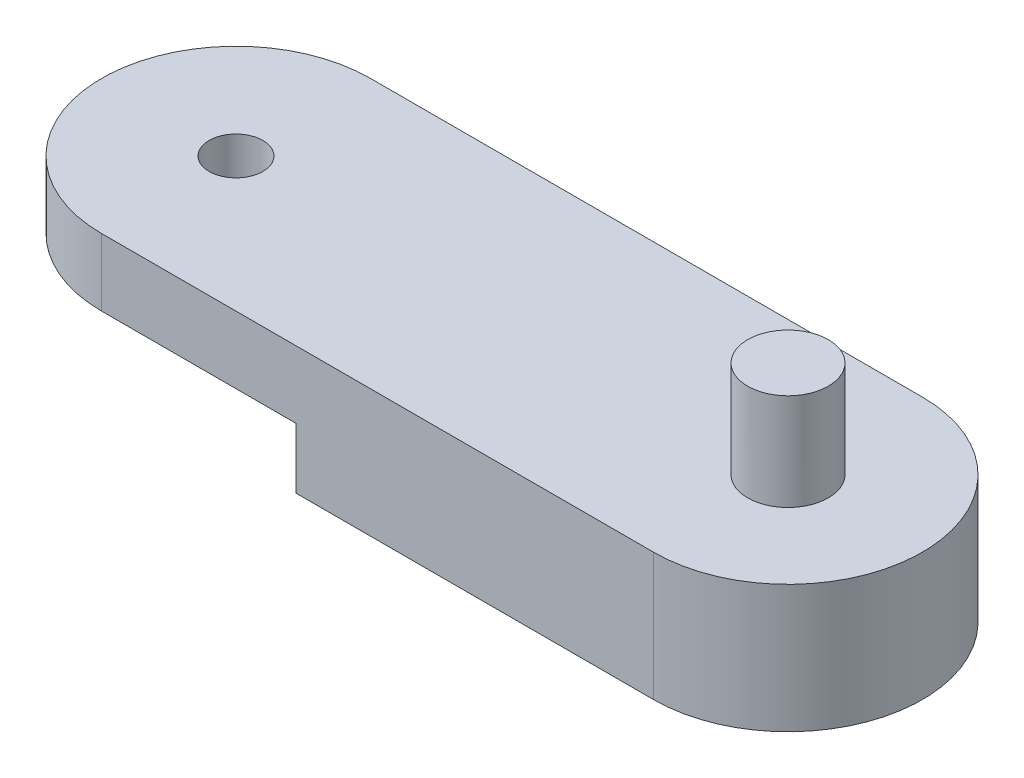
ISO-10303-21;
HEADER;
FILE_DESCRIPTION(('STEP AP214'),'2;1');
FILE_NAME('part.step','',(''),(''),'','','');
FILE_SCHEMA(('AUTOMOTIVE_DESIGN { 1 0 10303 214 1 1 1 1 }'));
ENDSEC;
DATA;
#1=APPLICATION_CONTEXT('core data for automotive mechanical design processes');
#2=APPLICATION_PROTOCOL_DEFINITION('international standard','automotive_design',2000,#1);
#3=PRODUCT_CONTEXT('',#1,'mechanical');
#4=PRODUCT('Part','Part','',(#3));
#5=PRODUCT_RELATED_PRODUCT_CATEGORY('part','',(#4));
#6=PRODUCT_DEFINITION_FORMATION('','',#4);
#7=PRODUCT_DEFINITION_CONTEXT('part definition',#1,'design');
#8=PRODUCT_DEFINITION('design','',#6,#7);
#9=PRODUCT_DEFINITION_SHAPE('','',#8);
#10=(LENGTH_UNIT() NAMED_UNIT(*) SI_UNIT(.MILLI.,.METRE.));
#11=(NAMED_UNIT(*) PLANE_ANGLE_UNIT() SI_UNIT($,.RADIAN.));
#12=(NAMED_UNIT(*) SI_UNIT($,.STERADIAN.) SOLID_ANGLE_UNIT());
#13=UNCERTAINTY_MEASURE_WITH_UNIT(LENGTH_MEASURE(1.E-05),#10,'distance_accuracy_value','');
#14=(GEOMETRIC_REPRESENTATION_CONTEXT(3) GLOBAL_UNCERTAINTY_ASSIGNED_CONTEXT((#13)) GLOBAL_UNIT_ASSIGNED_CONTEXT((#10,
#11,#12)) REPRESENTATION_CONTEXT('',''));
#15=CARTESIAN_POINT('',(0.,0.,0.));
#16=DIRECTION('',(0.,0.,1.));
#17=DIRECTION('',(1.,0.,0.));
#18=AXIS2_PLACEMENT_3D('',#15,#16,#17);
#19=CARTESIAN_POINT('',(0.,0.,0.));
#20=DIRECTION('',(0.,1.,0.));
#21=DIRECTION('',(0.,0.,1.));
#22=AXIS2_PLACEMENT_3D('',#19,#20,#21);
#23=PLANE('',#22);
#24=CARTESIAN_POINT('',(58.924703641992,0.,0.));
#25=DIRECTION('',(0.,1.,0.));
#26=DIRECTION('',(0.,0.,1.));
#27=AXIS2_PLACEMENT_3D('',#24,#25,#26);
#28=CIRCLE('',#27,2.);
#29=CARTESIAN_POINT('',(58.924703641992,0.,2.));
#30=VERTEX_POINT('',#29);
#31=EDGE_CURVE('E177',#30,#30,#28,.T.);
#32=ORIENTED_EDGE('',*,*,#31,.T.);
#33=EDGE_LOOP('',(#32));
#34=FACE_BOUND('',#33,.T.);
#35=CARTESIAN_POINT('',(58.924703641992,0.,0.));
#36=DIRECTION('',(0.,1.,0.));
#37=DIRECTION('',(0.,0.,1.));
#38=AXIS2_PLACEMENT_3D('',#35,#36,#37);
#39=CIRCLE('',#38,10.);
#40=CARTESIAN_POINT('',(58.924703641992,0.,-10.));
#41=VERTEX_POINT('',#40);
#42=CARTESIAN_POINT('',(58.924703641992,0.,10.));
#43=VERTEX_POINT('',#42);
#44=EDGE_CURVE('E186',#41,#43,#39,.T.);
#45=ORIENTED_EDGE('',*,*,#44,.F.);
#46=DIRECTION('',(-1.,0.,0.));
#47=VECTOR('',#46,1.);
#48=CARTESIAN_POINT('',(0.,0.,-10.));
#49=LINE('',#48,#47);
#50=CARTESIAN_POINT('',(73.407763219862,0.,-10.));
#51=VERTEX_POINT('',#50);
#52=EDGE_CURVE('E226',#51,#41,#49,.T.);
#53=ORIENTED_EDGE('',*,*,#52,.F.);
#54=DIRECTION('',(0.,0.,-1.));
#55=VECTOR('',#54,1.);
#56=CARTESIAN_POINT('',(73.407763219862,0.,10.));
#57=LINE('',#56,#55);
#58=CARTESIAN_POINT('',(73.407763219862,0.,10.));
#59=VERTEX_POINT('',#58);
#60=EDGE_CURVE('E135',#59,#51,#57,.T.);
#61=ORIENTED_EDGE('',*,*,#60,.F.);
#62=DIRECTION('',(1.,0.,0.));
#63=VECTOR('',#62,1.);
#64=CARTESIAN_POINT('',(0.,0.,10.));
#65=LINE('',#64,#63);
#66=EDGE_CURVE('E66',#43,#59,#65,.T.);
#67=ORIENTED_EDGE('',*,*,#66,.F.);
#68=EDGE_LOOP('',(#45,#53,#61,#67));
#69=FACE_BOUND('',#68,.T.);
#70=ADVANCED_FACE('F42',(#34,#69),#23,.F.);
#71=CARTESIAN_POINT('',(0.,5.,0.));
#72=DIRECTION('',(0.,1.,0.));
#73=DIRECTION('',(0.,0.,1.));
#74=AXIS2_PLACEMENT_3D('',#71,#72,#73);
#75=PLANE('',#74);
#76=CARTESIAN_POINT('',(58.924703641992,5.,0.));
#77=DIRECTION('',(0.,1.,0.));
#78=DIRECTION('',(0.,0.,1.));
#79=AXIS2_PLACEMENT_3D('',#76,#77,#78);
#80=CIRCLE('',#79,2.);
#81=CARTESIAN_POINT('',(58.924703641992,5.,2.));
#82=VERTEX_POINT('',#81);
#83=EDGE_CURVE('E171',#82,#82,#80,.T.);
#84=ORIENTED_EDGE('',*,*,#83,.F.);
#85=EDGE_LOOP('',(#84));
#86=FACE_BOUND('',#85,.T.);
#87=CARTESIAN_POINT('',(100.,5.,0.));
#88=DIRECTION('',(0.,1.,0.));
#89=DIRECTION('',(0.,0.,1.));
#90=AXIS2_PLACEMENT_3D('',#87,#88,#89);
#91=CIRCLE('',#90,3.00000000000001);
#92=CARTESIAN_POINT('',(100.,5.,3.00000000000001));
#93=VERTEX_POINT('',#92);
#94=EDGE_CURVE('E218',#93,#93,#91,.T.);
#95=ORIENTED_EDGE('',*,*,#94,.F.);
#96=EDGE_LOOP('',(#95));
#97=FACE_BOUND('',#96,.T.);
#98=DIRECTION('',(-1.,0.,0.));
#99=VECTOR('',#98,1.);
#100=CARTESIAN_POINT('',(0.,5.,-10.));
#101=LINE('',#100,#99);
#102=CARTESIAN_POINT('',(100.,5.,-10.));
#103=VERTEX_POINT('',#102);
#104=CARTESIAN_POINT('',(58.924703641992,5.,-10.));
#105=VERTEX_POINT('',#104);
#106=EDGE_CURVE('E229',#103,#105,#101,.T.);
#107=ORIENTED_EDGE('',*,*,#106,.T.);
#108=CARTESIAN_POINT('',(58.924703641992,5.,0.));
#109=DIRECTION('',(0.,1.,0.));
#110=DIRECTION('',(0.,0.,1.));
#111=AXIS2_PLACEMENT_3D('',#108,#109,#110);
#112=CIRCLE('',#111,10.);
#113=CARTESIAN_POINT('',(58.924703641992,5.,10.));
#114=VERTEX_POINT('',#113);
#115=EDGE_CURVE('E59',#105,#114,#112,.T.);
#116=ORIENTED_EDGE('',*,*,#115,.T.);
#117=DIRECTION('',(1.,0.,0.));
#118=VECTOR('',#117,1.);
#119=CARTESIAN_POINT('',(0.,5.,10.));
#120=LINE('',#119,#118);
#121=CARTESIAN_POINT('',(100.,5.,10.));
#122=VERTEX_POINT('',#121);
#123=EDGE_CURVE('E222',#114,#122,#120,.T.);
#124=ORIENTED_EDGE('',*,*,#123,.T.);
#125=CARTESIAN_POINT('',(100.,5.,0.));
#126=DIRECTION('',(0.,1.,0.));
#127=DIRECTION('',(0.,0.,1.));
#128=AXIS2_PLACEMENT_3D('',#125,#126,#127);
#129=CIRCLE('',#128,10.);
#130=EDGE_CURVE('E225',#122,#103,#129,.T.);
#131=ORIENTED_EDGE('',*,*,#130,.T.);
#132=EDGE_LOOP('',(#107,#116,#124,#131));
#133=FACE_BOUND('',#132,.T.);
#134=ADVANCED_FACE('F259',(#86,#97,#133),#75,.T.);
#135=CARTESIAN_POINT('',(0.,5.,10.));
#136=DIRECTION('',(0.,0.,-1.));
#137=DIRECTION('',(-1.,0.,0.));
#138=AXIS2_PLACEMENT_3D('',#135,#136,#137);
#139=PLANE('',#138);
#140=DIRECTION('',(0.,1.,0.));
#141=VECTOR('',#140,1.);
#142=CARTESIAN_POINT('',(58.924703641992,-5.,10.));
#143=LINE('',#142,#141);
#144=EDGE_CURVE('E183',#43,#114,#143,.T.);
#145=ORIENTED_EDGE('',*,*,#144,.F.);
#146=ORIENTED_EDGE('',*,*,#66,.T.);
#147=DIRECTION('',(0.,1.,0.));
#148=VECTOR('',#147,1.);
#149=CARTESIAN_POINT('',(73.407763219862,-4.5,10.));
#150=LINE('',#149,#148);
#151=CARTESIAN_POINT('',(73.407763219862,-4.5,10.));
#152=VERTEX_POINT('',#151);
#153=EDGE_CURVE('E214',#152,#59,#150,.T.);
#154=ORIENTED_EDGE('',*,*,#153,.F.);
#155=DIRECTION('',(-1.,0.,0.));
#156=VECTOR('',#155,1.);
#157=CARTESIAN_POINT('',(100.,-4.5,10.));
#158=LINE('',#157,#156);
#159=CARTESIAN_POINT('',(100.,-4.5,10.));
#160=VERTEX_POINT('',#159);
#161=EDGE_CURVE('E197',#160,#152,#158,.T.);
#162=ORIENTED_EDGE('',*,*,#161,.F.);
#163=DIRECTION('',(0.,-1.,0.));
#164=VECTOR('',#163,1.);
#165=CARTESIAN_POINT('',(100.,5.,10.));
#166=LINE('',#165,#164);
#167=EDGE_CURVE('E52',#122,#160,#166,.T.);
#168=ORIENTED_EDGE('',*,*,#167,.F.);
#169=ORIENTED_EDGE('',*,*,#123,.F.);
#170=EDGE_LOOP('',(#145,#146,#154,#162,#168,#169));
#171=FACE_BOUND('',#170,.T.);
#172=ADVANCED_FACE('F44',(#171),#139,.F.);
#173=CARTESIAN_POINT('',(100.,5.,0.));
#174=DIRECTION('',(0.,-1.,0.));
#175=DIRECTION('',(0.,0.,-1.));
#176=AXIS2_PLACEMENT_3D('',#173,#174,#175);
#177=CYLINDRICAL_SURFACE('',#176,10.);
#178=ORIENTED_EDGE('',*,*,#167,.T.);
#179=CARTESIAN_POINT('',(100.,-4.5,0.));
#180=DIRECTION('',(0.,-1.,0.));
#181=DIRECTION('',(0.,0.,-1.));
#182=AXIS2_PLACEMENT_3D('',#179,#180,#181);
#183=CIRCLE('',#182,10.);
#184=CARTESIAN_POINT('',(100.,-4.5,-10.));
#185=VERTEX_POINT('',#184);
#186=EDGE_CURVE('E193',#185,#160,#183,.T.);
#187=ORIENTED_EDGE('',*,*,#186,.F.);
#188=DIRECTION('',(0.,-1.,0.));
#189=VECTOR('',#188,1.);
#190=CARTESIAN_POINT('',(100.,5.,-10.));
#191=LINE('',#190,#189);
#192=EDGE_CURVE('E233',#103,#185,#191,.T.);
#193=ORIENTED_EDGE('',*,*,#192,.F.);
#194=ORIENTED_EDGE('',*,*,#130,.F.);
#195=EDGE_LOOP('',(#178,#187,#193,#194));
#196=FACE_BOUND('',#195,.T.);
#197=ADVANCED_FACE('F247',(#196),#177,.T.);
#198=CARTESIAN_POINT('',(0.,5.,-10.));
#199=DIRECTION('',(0.,0.,1.));
#200=DIRECTION('',(1.,0.,0.));
#201=AXIS2_PLACEMENT_3D('',#198,#199,#200);
#202=PLANE('',#201);
#203=ORIENTED_EDGE('',*,*,#52,.T.);
#204=DIRECTION('',(0.,1.,0.));
#205=VECTOR('',#204,1.);
#206=CARTESIAN_POINT('',(58.924703641992,-5.,-10.));
#207=LINE('',#206,#205);
#208=EDGE_CURVE('E11',#41,#105,#207,.T.);
#209=ORIENTED_EDGE('',*,*,#208,.T.);
#210=ORIENTED_EDGE('',*,*,#106,.F.);
#211=ORIENTED_EDGE('',*,*,#192,.T.);
#212=DIRECTION('',(1.,0.,0.));
#213=VECTOR('',#212,1.);
#214=CARTESIAN_POINT('',(100.,-4.5,-10.));
#215=LINE('',#214,#213);
#216=CARTESIAN_POINT('',(73.407763219862,-4.5,-10.));
#217=VERTEX_POINT('',#216);
#218=EDGE_CURVE('E203',#217,#185,#215,.T.);
#219=ORIENTED_EDGE('',*,*,#218,.F.);
#220=DIRECTION('',(0.,1.,0.));
#221=VECTOR('',#220,1.);
#222=CARTESIAN_POINT('',(73.407763219862,-4.5,-10.));
#223=LINE('',#222,#221);
#224=EDGE_CURVE('E207',#217,#51,#223,.T.);
#225=ORIENTED_EDGE('',*,*,#224,.T.);
#226=EDGE_LOOP('',(#203,#209,#210,#211,#219,#225));
#227=FACE_BOUND('',#226,.T.);
#228=ADVANCED_FACE('F256',(#227),#202,.F.);
#229=CARTESIAN_POINT('',(100.,15.,0.));
#230=DIRECTION('',(0.,-1.,0.));
#231=DIRECTION('',(0.,0.,-1.));
#232=AXIS2_PLACEMENT_3D('',#229,#230,#231);
#233=CYLINDRICAL_SURFACE('',#232,3.00000000000001);
#234=CARTESIAN_POINT('',(100.,12.2,0.));
#235=DIRECTION('',(0.,-1.,0.));
#236=DIRECTION('',(0.,0.,-1.));
#237=AXIS2_PLACEMENT_3D('',#234,#235,#236);
#238=CIRCLE('',#237,3.00000000000001);
#239=CARTESIAN_POINT('',(100.,12.2,-3.00000000000001));
#240=VERTEX_POINT('',#239);
#241=EDGE_CURVE('E46',#240,#240,#238,.T.);
#242=ORIENTED_EDGE('',*,*,#241,.T.);
#243=EDGE_LOOP('',(#242));
#244=FACE_BOUND('',#243,.T.);
#245=ORIENTED_EDGE('',*,*,#94,.T.);
#246=EDGE_LOOP('',(#245));
#247=FACE_BOUND('',#246,.T.);
#248=ADVANCED_FACE('F265',(#244,#247),#233,.T.);
#249=CARTESIAN_POINT('',(73.407763219862,-4.5,10.));
#250=DIRECTION('',(1.,0.,0.));
#251=DIRECTION('',(0.,0.,-1.));
#252=AXIS2_PLACEMENT_3D('',#249,#250,#251);
#253=PLANE('',#252);
#254=ORIENTED_EDGE('',*,*,#60,.T.);
#255=ORIENTED_EDGE('',*,*,#224,.F.);
#256=DIRECTION('',(0.,0.,-1.));
#257=VECTOR('',#256,1.);
#258=CARTESIAN_POINT('',(73.407763219862,-4.5,10.));
#259=LINE('',#258,#257);
#260=EDGE_CURVE('E200',#152,#217,#259,.T.);
#261=ORIENTED_EDGE('',*,*,#260,.F.);
#262=ORIENTED_EDGE('',*,*,#153,.T.);
#263=EDGE_LOOP('',(#254,#255,#261,#262));
#264=FACE_BOUND('',#263,.T.);
#265=ADVANCED_FACE('F263',(#264),#253,.F.);
#266=CARTESIAN_POINT('',(100.,-4.5,0.));
#267=DIRECTION('',(0.,-1.,0.));
#268=DIRECTION('',(0.,0.,-1.));
#269=AXIS2_PLACEMENT_3D('',#266,#267,#268);
#270=PLANE('',#269);
#271=DIRECTION('',(-0.991767779522836,0.,-0.128049488481378));
#272=VECTOR('',#271,1.);
#273=CARTESIAN_POINT('',(79.849230427639,-4.5,2.28859322850326));
#274=LINE('',#273,#272);
#275=CARTESIAN_POINT('',(99.3789537370813,-4.5,4.81012208998746));
#276=VERTEX_POINT('',#275);
#277=CARTESIAN_POINT('',(79.849230427639,-4.5,2.28859322850326));
#278=VERTEX_POINT('',#277);
#279=EDGE_CURVE('E152',#276,#278,#274,.T.);
#280=ORIENTED_EDGE('',*,*,#279,.F.);
#281=CARTESIAN_POINT('',(100.,-4.5,0.));
#282=DIRECTION('',(0.,-1.,0.));
#283=DIRECTION('',(0.,0.,-1.));
#284=AXIS2_PLACEMENT_3D('',#281,#282,#283);
#285=CIRCLE('',#284,4.85004876071064);
#286=CARTESIAN_POINT('',(99.3789537370812,-4.5,-4.81012208998748));
#287=VERTEX_POINT('',#286);
#288=EDGE_CURVE('E155',#287,#276,#285,.T.);
#289=ORIENTED_EDGE('',*,*,#288,.F.);
#290=DIRECTION('',(0.991767779522836,0.,-0.128049488481382));
#291=VECTOR('',#290,1.);
#292=CARTESIAN_POINT('',(79.8492304276391,-4.5,-2.28859322850324));
#293=LINE('',#292,#291);
#294=CARTESIAN_POINT('',(79.8492304276391,-4.5,-2.28859322850324));
#295=VERTEX_POINT('',#294);
#296=EDGE_CURVE('E162',#295,#287,#293,.T.);
#297=ORIENTED_EDGE('',*,*,#296,.F.);
#298=CARTESIAN_POINT('',(79.849230427639,-4.5,0.));
#299=DIRECTION('',(0.,-1.,0.));
#300=DIRECTION('',(0.,0.,-1.));
#301=AXIS2_PLACEMENT_3D('',#298,#299,#300);
#302=CIRCLE('',#301,2.28859322850326);
#303=EDGE_CURVE('E130',#278,#295,#302,.T.);
#304=ORIENTED_EDGE('',*,*,#303,.F.);
#305=EDGE_LOOP('',(#280,#289,#297,#304));
#306=FACE_BOUND('',#305,.T.);
#307=ORIENTED_EDGE('',*,*,#186,.T.);
#308=ORIENTED_EDGE('',*,*,#161,.T.);
#309=ORIENTED_EDGE('',*,*,#260,.T.);
#310=ORIENTED_EDGE('',*,*,#218,.T.);
#311=EDGE_LOOP('',(#307,#308,#309,#310));
#312=FACE_BOUND('',#311,.T.);
#313=ADVANCED_FACE('F252',(#306,#312),#270,.T.);
#314=CARTESIAN_POINT('',(79.849230427639,0.,0.));
#315=DIRECTION('',(0.,-1.,0.));
#316=DIRECTION('',(0.,0.,-1.));
#317=AXIS2_PLACEMENT_3D('',#314,#315,#316);
#318=CYLINDRICAL_SURFACE('',#317,2.28859322850326);
#319=ORIENTED_EDGE('',*,*,#303,.T.);
#320=DIRECTION('',(0.,-1.,0.));
#321=VECTOR('',#320,1.);
#322=CARTESIAN_POINT('',(79.849230427639,0.,-2.28859322850323));
#323=LINE('',#322,#321);
#324=CARTESIAN_POINT('',(79.8492304276391,1.5,-2.28859322850324));
#325=VERTEX_POINT('',#324);
#326=EDGE_CURVE('E122',#325,#295,#323,.T.);
#327=ORIENTED_EDGE('',*,*,#326,.F.);
#328=CARTESIAN_POINT('',(79.849230427639,1.5,0.));
#329=DIRECTION('',(0.,-1.,0.));
#330=DIRECTION('',(0.,0.,-1.));
#331=AXIS2_PLACEMENT_3D('',#328,#329,#330);
#332=CIRCLE('',#331,2.28859322850325);
#333=CARTESIAN_POINT('',(79.849230427639,1.5,2.28859322850326));
#334=VERTEX_POINT('',#333);
#335=EDGE_CURVE('E127',#334,#325,#332,.T.);
#336=ORIENTED_EDGE('',*,*,#335,.F.);
#337=DIRECTION('',(0.,-1.,0.));
#338=VECTOR('',#337,1.);
#339=CARTESIAN_POINT('',(79.849230427639,0.,2.28859322850326));
#340=LINE('',#339,#338);
#341=EDGE_CURVE('E136',#334,#278,#340,.T.);
#342=ORIENTED_EDGE('',*,*,#341,.T.);
#343=EDGE_LOOP('',(#319,#327,#336,#342));
#344=FACE_BOUND('',#343,.T.);
#345=ADVANCED_FACE('F124',(#344),#318,.F.);
#346=CARTESIAN_POINT('',(58.924703641992,-5.,0.));
#347=DIRECTION('',(0.,1.,0.));
#348=DIRECTION('',(0.,0.,1.));
#349=AXIS2_PLACEMENT_3D('',#346,#347,#348);
#350=CYLINDRICAL_SURFACE('',#349,10.);
#351=ORIENTED_EDGE('',*,*,#44,.T.);
#352=ORIENTED_EDGE('',*,*,#144,.T.);
#353=ORIENTED_EDGE('',*,*,#115,.F.);
#354=ORIENTED_EDGE('',*,*,#208,.F.);
#355=EDGE_LOOP('',(#351,#352,#353,#354));
#356=FACE_BOUND('',#355,.T.);
#357=ADVANCED_FACE('F304',(#356),#350,.T.);
#358=CARTESIAN_POINT('',(58.924703641992,-5.,0.));
#359=DIRECTION('',(0.,1.,0.));
#360=DIRECTION('',(0.,0.,1.));
#361=AXIS2_PLACEMENT_3D('',#358,#359,#360);
#362=CYLINDRICAL_SURFACE('',#361,2.);
#363=ORIENTED_EDGE('',*,*,#83,.T.);
#364=EDGE_LOOP('',(#363));
#365=FACE_BOUND('',#364,.T.);
#366=ORIENTED_EDGE('',*,*,#31,.F.);
#367=EDGE_LOOP('',(#366));
#368=FACE_BOUND('',#367,.T.);
#369=ADVANCED_FACE('F308',(#365,#368),#362,.F.);
#370=CARTESIAN_POINT('',(79.849230427639,1.5,2.28859322850326));
#371=DIRECTION('',(-0.128049488481378,0.,0.991767779522836));
#372=DIRECTION('',(0.991767779522836,0.,0.128049488481378));
#373=AXIS2_PLACEMENT_3D('',#370,#371,#372);
#374=PLANE('',#373);
#375=ORIENTED_EDGE('',*,*,#279,.T.);
#376=ORIENTED_EDGE('',*,*,#341,.F.);
#377=DIRECTION('',(-0.991767779522836,0.,-0.128049488481378));
#378=VECTOR('',#377,1.);
#379=CARTESIAN_POINT('',(79.849230427639,1.5,2.28859322850326));
#380=LINE('',#379,#378);
#381=CARTESIAN_POINT('',(99.3789537370813,1.5,4.81012208998746));
#382=VERTEX_POINT('',#381);
#383=EDGE_CURVE('E150',#382,#334,#380,.T.);
#384=ORIENTED_EDGE('',*,*,#383,.F.);
#385=DIRECTION('',(0.,-1.,0.));
#386=VECTOR('',#385,1.);
#387=CARTESIAN_POINT('',(99.3789537370813,1.5,4.81012208998746));
#388=LINE('',#387,#386);
#389=EDGE_CURVE('E168',#382,#276,#388,.T.);
#390=ORIENTED_EDGE('',*,*,#389,.T.);
#391=EDGE_LOOP('',(#375,#376,#384,#390));
#392=FACE_BOUND('',#391,.T.);
#393=ADVANCED_FACE('F323',(#392),#374,.F.);
#394=CARTESIAN_POINT('',(100.,1.5,0.));
#395=DIRECTION('',(0.,-1.,0.));
#396=DIRECTION('',(0.,0.,-1.));
#397=AXIS2_PLACEMENT_3D('',#394,#395,#396);
#398=CYLINDRICAL_SURFACE('',#397,4.85004876071064);
#399=ORIENTED_EDGE('',*,*,#288,.T.);
#400=ORIENTED_EDGE('',*,*,#389,.F.);
#401=CARTESIAN_POINT('',(100.,1.5,0.));
#402=DIRECTION('',(0.,-1.,0.));
#403=DIRECTION('',(0.,0.,-1.));
#404=AXIS2_PLACEMENT_3D('',#401,#402,#403);
#405=CIRCLE('',#404,4.85004876071064);
#406=CARTESIAN_POINT('',(99.3789537370812,1.5,-4.81012208998748));
#407=VERTEX_POINT('',#406);
#408=EDGE_CURVE('E146',#407,#382,#405,.T.);
#409=ORIENTED_EDGE('',*,*,#408,.F.);
#410=DIRECTION('',(0.,-1.,0.));
#411=VECTOR('',#410,1.);
#412=CARTESIAN_POINT('',(99.3789537370812,1.5,-4.81012208998748));
#413=LINE('',#412,#411);
#414=EDGE_CURVE('E141',#407,#287,#413,.T.);
#415=ORIENTED_EDGE('',*,*,#414,.T.);
#416=EDGE_LOOP('',(#399,#400,#409,#415));
#417=FACE_BOUND('',#416,.T.);
#418=ADVANCED_FACE('F330',(#417),#398,.F.);
#419=CARTESIAN_POINT('',(79.8492304276391,1.5,-2.28859322850324));
#420=DIRECTION('',(-0.128049488481382,0.,-0.991767779522836));
#421=DIRECTION('',(-0.991767779522836,0.,0.128049488481382));
#422=AXIS2_PLACEMENT_3D('',#419,#420,#421);
#423=PLANE('',#422);
#424=ORIENTED_EDGE('',*,*,#296,.T.);
#425=ORIENTED_EDGE('',*,*,#414,.F.);
#426=DIRECTION('',(0.991767779522836,0.,-0.128049488481382));
#427=VECTOR('',#426,1.);
#428=CARTESIAN_POINT('',(79.8492304276391,1.5,-2.28859322850324));
#429=LINE('',#428,#427);
#430=EDGE_CURVE('E139',#325,#407,#429,.T.);
#431=ORIENTED_EDGE('',*,*,#430,.F.);
#432=ORIENTED_EDGE('',*,*,#326,.T.);
#433=EDGE_LOOP('',(#424,#425,#431,#432));
#434=FACE_BOUND('',#433,.T.);
#435=ADVANCED_FACE('F140',(#434),#423,.F.);
#436=CARTESIAN_POINT('',(79.849230427639,1.5,0.));
#437=DIRECTION('',(0.,-1.,0.));
#438=DIRECTION('',(0.,0.,-1.));
#439=AXIS2_PLACEMENT_3D('',#436,#437,#438);
#440=PLANE('',#439);
#441=ORIENTED_EDGE('',*,*,#335,.T.);
#442=ORIENTED_EDGE('',*,*,#430,.T.);
#443=ORIENTED_EDGE('',*,*,#408,.T.);
#444=ORIENTED_EDGE('',*,*,#383,.T.);
#445=EDGE_LOOP('',(#441,#442,#443,#444));
#446=FACE_BOUND('',#445,.T.);
#447=ADVANCED_FACE('F148',(#446),#440,.T.);
#448=CARTESIAN_POINT('',(0.,12.2,0.));
#449=DIRECTION('',(0.,-1.,0.));
#450=DIRECTION('',(0.,0.,-1.));
#451=AXIS2_PLACEMENT_3D('',#448,#449,#450);
#452=PLANE('',#451);
#453=ORIENTED_EDGE('',*,*,#241,.F.);
#454=EDGE_LOOP('',(#453));
#455=FACE_BOUND('',#454,.T.);
#456=ADVANCED_FACE('F351',(#455),#452,.F.);
#457=CLOSED_SHELL('',(#70,#134,#172,#197,#228,#248,#265,#313,#345,#357,#369,#393,#418,#435,#447,#456));
#458=MANIFOLD_SOLID_BREP('B2',#457);
#459=ADVANCED_BREP_SHAPE_REPRESENTATION('',(#18,#458),#14);
#460=SHAPE_DEFINITION_REPRESENTATION(#9,#459);
ENDSEC;
END-ISO-10303-21;
